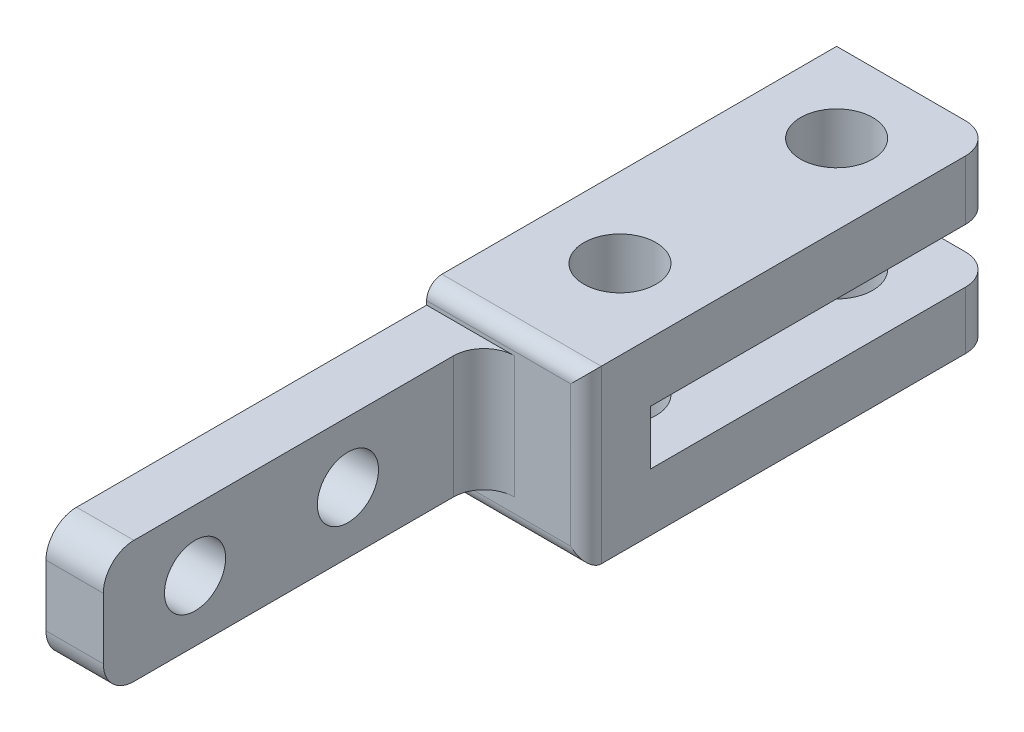
ISO-10303-21;
HEADER;
FILE_DESCRIPTION(('STEP AP214'),'2;1');
FILE_NAME('part.step','',(''),(''),'','','');
FILE_SCHEMA(('AUTOMOTIVE_DESIGN { 1 0 10303 214 1 1 1 1 }'));
ENDSEC;
DATA;
#1=APPLICATION_CONTEXT('core data for automotive mechanical design processes');
#2=APPLICATION_PROTOCOL_DEFINITION('international standard','automotive_design',2000,#1);
#3=PRODUCT_CONTEXT('',#1,'mechanical');
#4=PRODUCT('Part','Part','',(#3));
#5=PRODUCT_RELATED_PRODUCT_CATEGORY('part','',(#4));
#6=PRODUCT_DEFINITION_FORMATION('','',#4);
#7=PRODUCT_DEFINITION_CONTEXT('part definition',#1,'design');
#8=PRODUCT_DEFINITION('design','',#6,#7);
#9=PRODUCT_DEFINITION_SHAPE('','',#8);
#10=(LENGTH_UNIT() NAMED_UNIT(*) SI_UNIT(.MILLI.,.METRE.));
#11=(NAMED_UNIT(*) PLANE_ANGLE_UNIT() SI_UNIT($,.RADIAN.));
#12=(NAMED_UNIT(*) SI_UNIT($,.STERADIAN.) SOLID_ANGLE_UNIT());
#13=UNCERTAINTY_MEASURE_WITH_UNIT(LENGTH_MEASURE(1.E-05),#10,'distance_accuracy_value','');
#14=(GEOMETRIC_REPRESENTATION_CONTEXT(3) GLOBAL_UNCERTAINTY_ASSIGNED_CONTEXT((#13)) GLOBAL_UNIT_ASSIGNED_CONTEXT((#10,
#11,#12)) REPRESENTATION_CONTEXT('',''));
#15=CARTESIAN_POINT('',(0.,0.,0.));
#16=DIRECTION('',(0.,0.,1.));
#17=DIRECTION('',(1.,0.,0.));
#18=AXIS2_PLACEMENT_3D('',#15,#16,#17);
#19=CARTESIAN_POINT('',(0.,-2.4765,-30.8864));
#20=DIRECTION('',(0.,0.,-1.));
#21=DIRECTION('',(-1.,0.,0.));
#22=AXIS2_PLACEMENT_3D('',#19,#20,#21);
#23=PLANE('',#22);
#24=DIRECTION('',(-1.,0.,0.));
#25=VECTOR('',#24,1.);
#26=CARTESIAN_POINT('',(0.,2.30886,-30.8864));
#27=LINE('',#26,#25);
#28=CARTESIAN_POINT('',(10.69848,2.30886,-30.8864));
#29=VERTEX_POINT('',#28);
#30=CARTESIAN_POINT('',(0.,2.30886,-30.8864));
#31=VERTEX_POINT('',#30);
#32=EDGE_CURVE('E189',#29,#31,#27,.T.);
#33=ORIENTED_EDGE('',*,*,#32,.F.);
#34=DIRECTION('',(0.,1.,0.));
#35=VECTOR('',#34,1.);
#36=CARTESIAN_POINT('',(10.69848,-2.4765,-30.8864));
#37=LINE('',#36,#35);
#38=CARTESIAN_POINT('',(10.69848,-2.4765,-30.8864));
#39=VERTEX_POINT('',#38);
#40=EDGE_CURVE('E287',#29,#39,#37,.F.);
#41=ORIENTED_EDGE('',*,*,#40,.T.);
#42=DIRECTION('',(-1.,0.,0.));
#43=VECTOR('',#42,1.);
#44=CARTESIAN_POINT('',(0.,-2.4765,-30.8864));
#45=LINE('',#44,#43);
#46=CARTESIAN_POINT('',(0.,-2.4765,-30.8864));
#47=VERTEX_POINT('',#46);
#48=EDGE_CURVE('E232',#39,#47,#45,.T.);
#49=ORIENTED_EDGE('',*,*,#48,.T.);
#50=DIRECTION('',(0.,1.,0.));
#51=VECTOR('',#50,1.);
#52=CARTESIAN_POINT('',(0.,-2.4765,-30.8864));
#53=LINE('',#52,#51);
#54=EDGE_CURVE('E235',#47,#31,#53,.T.);
#55=ORIENTED_EDGE('',*,*,#54,.T.);
#56=EDGE_LOOP('',(#33,#41,#49,#55));
#57=FACE_BOUND('',#56,.T.);
#58=ADVANCED_FACE('F36',(#57),#23,.T.);
#59=CARTESIAN_POINT('',(6.61924,-2.4765,-6.26618));
#60=DIRECTION('',(0.,1.,0.));
#61=DIRECTION('',(0.,0.,1.));
#62=AXIS2_PLACEMENT_3D('',#59,#60,#61);
#63=CYLINDRICAL_SURFACE('',#62,2.99974);
#64=CARTESIAN_POINT('',(6.61924,2.30886,-6.26618));
#65=DIRECTION('',(0.,-1.,0.));
#66=DIRECTION('',(1.,0.,0.));
#67=AXIS2_PLACEMENT_3D('',#64,#65,#66);
#68=CIRCLE('',#67,2.99974);
#69=CARTESIAN_POINT('',(9.61898,2.30886,-6.26618));
#70=VERTEX_POINT('',#69);
#71=EDGE_CURVE('E207',#70,#70,#68,.F.);
#72=ORIENTED_EDGE('',*,*,#71,.T.);
#73=EDGE_LOOP('',(#72));
#74=FACE_BOUND('',#73,.T.);
#75=CARTESIAN_POINT('',(6.61924,-2.4765,-6.26618));
#76=DIRECTION('',(0.,1.,0.));
#77=DIRECTION('',(0.,0.,1.));
#78=AXIS2_PLACEMENT_3D('',#75,#76,#77);
#79=CIRCLE('',#78,2.99974);
#80=CARTESIAN_POINT('',(6.61924,-2.4765,-3.26644000000001));
#81=VERTEX_POINT('',#80);
#82=EDGE_CURVE('E225',#81,#81,#79,.T.);
#83=ORIENTED_EDGE('',*,*,#82,.F.);
#84=EDGE_LOOP('',(#83));
#85=FACE_BOUND('',#84,.T.);
#86=ADVANCED_FACE('F431',(#74,#85),#63,.F.);
#87=CARTESIAN_POINT('',(6.61924,-2.4765,-24.26716));
#88=DIRECTION('',(0.,1.,0.));
#89=DIRECTION('',(0.,0.,1.));
#90=AXIS2_PLACEMENT_3D('',#87,#88,#89);
#91=CYLINDRICAL_SURFACE('',#90,2.99974);
#92=CARTESIAN_POINT('',(6.61924,2.30886,-24.26716));
#93=DIRECTION('',(0.,-1.,0.));
#94=DIRECTION('',(1.,0.,0.));
#95=AXIS2_PLACEMENT_3D('',#92,#93,#94);
#96=CIRCLE('',#95,2.99974);
#97=CARTESIAN_POINT('',(9.61898,2.30886,-24.26716));
#98=VERTEX_POINT('',#97);
#99=EDGE_CURVE('E205',#98,#98,#96,.F.);
#100=ORIENTED_EDGE('',*,*,#99,.T.);
#101=EDGE_LOOP('',(#100));
#102=FACE_BOUND('',#101,.T.);
#103=CARTESIAN_POINT('',(6.61924,-2.4765,-24.26716));
#104=DIRECTION('',(0.,1.,0.));
#105=DIRECTION('',(0.,0.,1.));
#106=AXIS2_PLACEMENT_3D('',#103,#104,#105);
#107=CIRCLE('',#106,2.99974);
#108=CARTESIAN_POINT('',(6.61924,-2.4765,-21.26742));
#109=VERTEX_POINT('',#108);
#110=EDGE_CURVE('E222',#109,#109,#107,.T.);
#111=ORIENTED_EDGE('',*,*,#110,.F.);
#112=EDGE_LOOP('',(#111));
#113=FACE_BOUND('',#112,.T.);
#114=ADVANCED_FACE('F435',(#102,#113),#91,.F.);
#115=CARTESIAN_POINT('',(0.,10.16,0.));
#116=DIRECTION('',(1.,0.,0.));
#117=DIRECTION('',(0.,0.,-1.));
#118=AXIS2_PLACEMENT_3D('',#115,#116,#117);
#119=PLANE('',#118);
#120=CARTESIAN_POINT('',(0.,5.08,27.178));
#121=DIRECTION('',(1.,0.,0.));
#122=DIRECTION('',(0.,0.,-1.));
#123=AXIS2_PLACEMENT_3D('',#120,#121,#122);
#124=CIRCLE('',#123,2.54);
#125=CARTESIAN_POINT('',(0.,5.08,24.638));
#126=VERTEX_POINT('',#125);
#127=EDGE_CURVE('E243',#126,#126,#124,.T.);
#128=ORIENTED_EDGE('',*,*,#127,.T.);
#129=EDGE_LOOP('',(#128));
#130=FACE_BOUND('',#129,.T.);
#131=CARTESIAN_POINT('',(0.,5.08,14.478));
#132=DIRECTION('',(1.,0.,0.));
#133=DIRECTION('',(0.,0.,-1.));
#134=AXIS2_PLACEMENT_3D('',#131,#132,#133);
#135=CIRCLE('',#134,2.54);
#136=CARTESIAN_POINT('',(0.,5.08,11.938));
#137=VERTEX_POINT('',#136);
#138=EDGE_CURVE('E242',#137,#137,#135,.T.);
#139=ORIENTED_EDGE('',*,*,#138,.T.);
#140=EDGE_LOOP('',(#139));
#141=FACE_BOUND('',#140,.T.);
#142=DIRECTION('',(0.,0.,1.));
#143=VECTOR('',#142,1.);
#144=CARTESIAN_POINT('',(0.,-2.4765,-30.8864));
#145=LINE('',#144,#143);
#146=CARTESIAN_POINT('',(0.,-2.4765,1.905));
#147=VERTEX_POINT('',#146);
#148=EDGE_CURVE('E228',#47,#147,#145,.T.);
#149=ORIENTED_EDGE('',*,*,#148,.T.);
#150=CARTESIAN_POINT('',(0.,-1.2065,1.905));
#151=DIRECTION('',(1.,0.,0.));
#152=DIRECTION('',(0.,0.,-1.));
#153=AXIS2_PLACEMENT_3D('',#150,#151,#152);
#154=CIRCLE('',#153,1.27);
#155=CARTESIAN_POINT('',(0.,-1.2065,3.175));
#156=VERTEX_POINT('',#155);
#157=EDGE_CURVE('E337',#147,#156,#154,.F.);
#158=ORIENTED_EDGE('',*,*,#157,.T.);
#159=DIRECTION('',(0.,1.,0.));
#160=VECTOR('',#159,1.);
#161=CARTESIAN_POINT('',(0.,-2.4765,3.175));
#162=LINE('',#161,#160);
#163=CARTESIAN_POINT('',(0.,0.,3.175));
#164=VERTEX_POINT('',#163);
#165=EDGE_CURVE('E239',#156,#164,#162,.T.);
#166=ORIENTED_EDGE('',*,*,#165,.T.);
#167=DIRECTION('',(0.,0.,1.));
#168=VECTOR('',#167,1.);
#169=CARTESIAN_POINT('',(0.,0.,0.));
#170=LINE('',#169,#168);
#171=CARTESIAN_POINT('',(0.,0.,32.258));
#172=VERTEX_POINT('',#171);
#173=EDGE_CURVE('E246',#164,#172,#170,.T.);
#174=ORIENTED_EDGE('',*,*,#173,.T.);
#175=CARTESIAN_POINT('',(0.,2.54,32.258));
#176=DIRECTION('',(1.,0.,0.));
#177=DIRECTION('',(0.,0.,-1.));
#178=AXIS2_PLACEMENT_3D('',#175,#176,#177);
#179=CIRCLE('',#178,2.54);
#180=CARTESIAN_POINT('',(0.,2.54,34.798));
#181=VERTEX_POINT('',#180);
#182=EDGE_CURVE('E317',#172,#181,#179,.F.);
#183=ORIENTED_EDGE('',*,*,#182,.T.);
#184=DIRECTION('',(0.,-1.,0.));
#185=VECTOR('',#184,1.);
#186=CARTESIAN_POINT('',(0.,10.16,34.798));
#187=LINE('',#186,#185);
#188=CARTESIAN_POINT('',(0.,7.62,34.798));
#189=VERTEX_POINT('',#188);
#190=EDGE_CURVE('E269',#189,#181,#187,.T.);
#191=ORIENTED_EDGE('',*,*,#190,.F.);
#192=CARTESIAN_POINT('',(0.,7.62,32.258));
#193=DIRECTION('',(1.,0.,0.));
#194=DIRECTION('',(0.,0.,-1.));
#195=AXIS2_PLACEMENT_3D('',#192,#193,#194);
#196=CIRCLE('',#195,2.54);
#197=CARTESIAN_POINT('',(0.,10.16,32.258));
#198=VERTEX_POINT('',#197);
#199=EDGE_CURVE('E315',#189,#198,#196,.F.);
#200=ORIENTED_EDGE('',*,*,#199,.T.);
#201=DIRECTION('',(0.,0.,1.));
#202=VECTOR('',#201,1.);
#203=CARTESIAN_POINT('',(0.,10.16,0.));
#204=LINE('',#203,#202);
#205=CARTESIAN_POINT('',(0.,10.16,3.175));
#206=VERTEX_POINT('',#205);
#207=EDGE_CURVE('E255',#206,#198,#204,.T.);
#208=ORIENTED_EDGE('',*,*,#207,.F.);
#209=CARTESIAN_POINT('',(0.,10.4775,3.175));
#210=VERTEX_POINT('',#209);
#211=EDGE_CURVE('E234',#206,#210,#162,.T.);
#212=ORIENTED_EDGE('',*,*,#211,.T.);
#213=CARTESIAN_POINT('',(0.,10.4775,1.905));
#214=DIRECTION('',(1.,0.,0.));
#215=DIRECTION('',(0.,0.,-1.));
#216=AXIS2_PLACEMENT_3D('',#213,#214,#215);
#217=CIRCLE('',#216,1.27);
#218=CARTESIAN_POINT('',(0.,11.7475,1.905));
#219=VERTEX_POINT('',#218);
#220=EDGE_CURVE('E59',#210,#219,#217,.F.);
#221=ORIENTED_EDGE('',*,*,#220,.T.);
#222=DIRECTION('',(0.,0.,1.));
#223=VECTOR('',#222,1.);
#224=CARTESIAN_POINT('',(0.,11.7475,-30.8864));
#225=LINE('',#224,#223);
#226=CARTESIAN_POINT('',(0.,11.7475,-30.8864));
#227=VERTEX_POINT('',#226);
#228=EDGE_CURVE('E216',#227,#219,#225,.T.);
#229=ORIENTED_EDGE('',*,*,#228,.F.);
#230=CARTESIAN_POINT('',(0.,6.81736,-30.8864));
#231=VERTEX_POINT('',#230);
#232=EDGE_CURVE('E195',#231,#227,#53,.T.);
#233=ORIENTED_EDGE('',*,*,#232,.F.);
#234=DIRECTION('',(0.,0.,-1.));
#235=VECTOR('',#234,1.);
#236=CARTESIAN_POINT('',(0.,6.81736,-2.18440000000001));
#237=LINE('',#236,#235);
#238=CARTESIAN_POINT('',(0.,6.81736,-2.18440000000001));
#239=VERTEX_POINT('',#238);
#240=EDGE_CURVE('E174',#239,#231,#237,.T.);
#241=ORIENTED_EDGE('',*,*,#240,.F.);
#242=DIRECTION('',(0.,1.,0.));
#243=VECTOR('',#242,1.);
#244=CARTESIAN_POINT('',(0.,6.81736,-2.18440000000001));
#245=LINE('',#244,#243);
#246=CARTESIAN_POINT('',(0.,2.30886,-2.18440000000001));
#247=VERTEX_POINT('',#246);
#248=EDGE_CURVE('E181',#247,#239,#245,.T.);
#249=ORIENTED_EDGE('',*,*,#248,.F.);
#250=DIRECTION('',(0.,0.,-1.));
#251=VECTOR('',#250,1.);
#252=CARTESIAN_POINT('',(0.,2.30886,-2.18440000000001));
#253=LINE('',#252,#251);
#254=EDGE_CURVE('E277',#247,#31,#253,.T.);
#255=ORIENTED_EDGE('',*,*,#254,.T.);
#256=ORIENTED_EDGE('',*,*,#54,.F.);
#257=EDGE_LOOP('',(#149,#158,#166,#174,#183,#191,#200,#208,#212,#221,#229,#233,#241,#249,#255,#256));
#258=FACE_BOUND('',#257,.T.);
#259=ADVANCED_FACE('F193',(#130,#141,#258),#119,.F.);
#260=CARTESIAN_POINT('',(0.,10.16,34.798));
#261=DIRECTION('',(0.,0.,-1.));
#262=DIRECTION('',(-1.,0.,0.));
#263=AXIS2_PLACEMENT_3D('',#260,#261,#262);
#264=PLANE('',#263);
#265=ORIENTED_EDGE('',*,*,#190,.T.);
#266=DIRECTION('',(1.,0.,0.));
#267=VECTOR('',#266,1.);
#268=CARTESIAN_POINT('',(0.,2.54,34.798));
#269=LINE('',#268,#267);
#270=CARTESIAN_POINT('',(4.7625,2.54,34.798));
#271=VERTEX_POINT('',#270);
#272=EDGE_CURVE('E310',#181,#271,#269,.T.);
#273=ORIENTED_EDGE('',*,*,#272,.T.);
#274=DIRECTION('',(0.,-1.,0.));
#275=VECTOR('',#274,1.);
#276=CARTESIAN_POINT('',(4.7625,10.16,34.798));
#277=LINE('',#276,#275);
#278=CARTESIAN_POINT('',(4.7625,7.62,34.798));
#279=VERTEX_POINT('',#278);
#280=EDGE_CURVE('E262',#279,#271,#277,.T.);
#281=ORIENTED_EDGE('',*,*,#280,.F.);
#282=DIRECTION('',(1.,0.,0.));
#283=VECTOR('',#282,1.);
#284=CARTESIAN_POINT('',(0.,7.62,34.798));
#285=LINE('',#284,#283);
#286=EDGE_CURVE('E308',#279,#189,#285,.F.);
#287=ORIENTED_EDGE('',*,*,#286,.T.);
#288=EDGE_LOOP('',(#265,#273,#281,#287));
#289=FACE_BOUND('',#288,.T.);
#290=ADVANCED_FACE('F392',(#289),#264,.F.);
#291=CARTESIAN_POINT('',(4.7625,10.16,0.));
#292=DIRECTION('',(-1.,0.,0.));
#293=DIRECTION('',(0.,0.,1.));
#294=AXIS2_PLACEMENT_3D('',#291,#292,#293);
#295=PLANE('',#294);
#296=CARTESIAN_POINT('',(4.7625,5.08,27.178));
#297=DIRECTION('',(1.,0.,0.));
#298=DIRECTION('',(0.,0.,-1.));
#299=AXIS2_PLACEMENT_3D('',#296,#297,#298);
#300=CIRCLE('',#299,2.54);
#301=CARTESIAN_POINT('',(4.7625,5.08,24.638));
#302=VERTEX_POINT('',#301);
#303=EDGE_CURVE('E247',#302,#302,#300,.T.);
#304=ORIENTED_EDGE('',*,*,#303,.F.);
#305=EDGE_LOOP('',(#304));
#306=FACE_BOUND('',#305,.T.);
#307=CARTESIAN_POINT('',(4.7625,5.08,14.478));
#308=DIRECTION('',(1.,0.,0.));
#309=DIRECTION('',(0.,0.,-1.));
#310=AXIS2_PLACEMENT_3D('',#307,#308,#309);
#311=CIRCLE('',#310,2.54);
#312=CARTESIAN_POINT('',(4.7625,5.08,11.938));
#313=VERTEX_POINT('',#312);
#314=EDGE_CURVE('E250',#313,#313,#311,.T.);
#315=ORIENTED_EDGE('',*,*,#314,.F.);
#316=EDGE_LOOP('',(#315));
#317=FACE_BOUND('',#316,.T.);
#318=DIRECTION('',(0.,0.,-1.));
#319=VECTOR('',#318,1.);
#320=CARTESIAN_POINT('',(4.7625,0.,0.));
#321=LINE('',#320,#319);
#322=CARTESIAN_POINT('',(4.7625,0.,32.258));
#323=VERTEX_POINT('',#322);
#324=CARTESIAN_POINT('',(4.7625,0.,5.715));
#325=VERTEX_POINT('',#324);
#326=EDGE_CURVE('E259',#323,#325,#321,.T.);
#327=ORIENTED_EDGE('',*,*,#326,.T.);
#328=DIRECTION('',(0.,1.,0.));
#329=VECTOR('',#328,1.);
#330=CARTESIAN_POINT('',(4.7625,10.16,5.715));
#331=LINE('',#330,#329);
#332=CARTESIAN_POINT('',(4.7625,10.16,5.715));
#333=VERTEX_POINT('',#332);
#334=EDGE_CURVE('E302',#325,#333,#331,.T.);
#335=ORIENTED_EDGE('',*,*,#334,.T.);
#336=DIRECTION('',(0.,0.,-1.));
#337=VECTOR('',#336,1.);
#338=CARTESIAN_POINT('',(4.7625,10.16,0.));
#339=LINE('',#338,#337);
#340=CARTESIAN_POINT('',(4.7625,10.16,32.258));
#341=VERTEX_POINT('',#340);
#342=EDGE_CURVE('E258',#341,#333,#339,.T.);
#343=ORIENTED_EDGE('',*,*,#342,.F.);
#344=CARTESIAN_POINT('',(4.7625,7.62,32.258));
#345=DIRECTION('',(-1.,0.,0.));
#346=DIRECTION('',(0.,0.,1.));
#347=AXIS2_PLACEMENT_3D('',#344,#345,#346);
#348=CIRCLE('',#347,2.54);
#349=EDGE_CURVE('E298',#341,#279,#348,.F.);
#350=ORIENTED_EDGE('',*,*,#349,.T.);
#351=ORIENTED_EDGE('',*,*,#280,.T.);
#352=CARTESIAN_POINT('',(4.7625,2.54,32.258));
#353=DIRECTION('',(-1.,0.,0.));
#354=DIRECTION('',(0.,0.,1.));
#355=AXIS2_PLACEMENT_3D('',#352,#353,#354);
#356=CIRCLE('',#355,2.54);
#357=EDGE_CURVE('E300',#271,#323,#356,.F.);
#358=ORIENTED_EDGE('',*,*,#357,.T.);
#359=EDGE_LOOP('',(#327,#335,#343,#350,#351,#358));
#360=FACE_BOUND('',#359,.T.);
#361=ADVANCED_FACE('F395',(#306,#317,#360),#295,.F.);
#362=CARTESIAN_POINT('',(0.,10.16,0.));
#363=DIRECTION('',(0.,1.,0.));
#364=DIRECTION('',(0.,0.,1.));
#365=AXIS2_PLACEMENT_3D('',#362,#363,#364);
#366=PLANE('',#365);
#367=ORIENTED_EDGE('',*,*,#207,.T.);
#368=DIRECTION('',(1.,0.,0.));
#369=VECTOR('',#368,1.);
#370=CARTESIAN_POINT('',(4.7625,10.16,32.258));
#371=LINE('',#370,#369);
#372=EDGE_CURVE('E319',#198,#341,#371,.T.);
#373=ORIENTED_EDGE('',*,*,#372,.T.);
#374=ORIENTED_EDGE('',*,*,#342,.T.);
#375=CARTESIAN_POINT('',(7.3025,10.16,5.715));
#376=DIRECTION('',(0.,1.,0.));
#377=DIRECTION('',(0.,0.,1.));
#378=AXIS2_PLACEMENT_3D('',#375,#376,#377);
#379=CIRCLE('',#378,2.54);
#380=CARTESIAN_POINT('',(7.3025,10.16,3.175));
#381=VERTEX_POINT('',#380);
#382=EDGE_CURVE('E322',#333,#381,#379,.F.);
#383=ORIENTED_EDGE('',*,*,#382,.T.);
#384=DIRECTION('',(1.,0.,0.));
#385=VECTOR('',#384,1.);
#386=CARTESIAN_POINT('',(0.,10.16,3.175));
#387=LINE('',#386,#385);
#388=EDGE_CURVE('E238',#206,#381,#387,.T.);
#389=ORIENTED_EDGE('',*,*,#388,.F.);
#390=EDGE_LOOP('',(#367,#373,#374,#383,#389));
#391=FACE_BOUND('',#390,.T.);
#392=ADVANCED_FACE('F403',(#391),#366,.T.);
#393=CARTESIAN_POINT('',(0.,0.,0.));
#394=DIRECTION('',(0.,1.,0.));
#395=DIRECTION('',(0.,0.,1.));
#396=AXIS2_PLACEMENT_3D('',#393,#394,#395);
#397=PLANE('',#396);
#398=ORIENTED_EDGE('',*,*,#326,.F.);
#399=DIRECTION('',(1.,0.,0.));
#400=VECTOR('',#399,1.);
#401=CARTESIAN_POINT('',(0.,0.,32.258));
#402=LINE('',#401,#400);
#403=EDGE_CURVE('E313',#323,#172,#402,.F.);
#404=ORIENTED_EDGE('',*,*,#403,.T.);
#405=ORIENTED_EDGE('',*,*,#173,.F.);
#406=DIRECTION('',(1.,0.,0.));
#407=VECTOR('',#406,1.);
#408=CARTESIAN_POINT('',(0.,0.,3.175));
#409=LINE('',#408,#407);
#410=CARTESIAN_POINT('',(7.3025,0.,3.175));
#411=VERTEX_POINT('',#410);
#412=EDGE_CURVE('E272',#164,#411,#409,.T.);
#413=ORIENTED_EDGE('',*,*,#412,.T.);
#414=CARTESIAN_POINT('',(7.3025,0.,5.715));
#415=DIRECTION('',(0.,1.,0.));
#416=DIRECTION('',(0.,0.,1.));
#417=AXIS2_PLACEMENT_3D('',#414,#415,#416);
#418=CIRCLE('',#417,2.54);
#419=EDGE_CURVE('E325',#411,#325,#418,.T.);
#420=ORIENTED_EDGE('',*,*,#419,.T.);
#421=EDGE_LOOP('',(#398,#404,#405,#413,#420));
#422=FACE_BOUND('',#421,.T.);
#423=ADVANCED_FACE('F547',(#422),#397,.F.);
#424=CARTESIAN_POINT('',(0.,5.08,14.478));
#425=DIRECTION('',(1.,0.,0.));
#426=DIRECTION('',(0.,0.,-1.));
#427=AXIS2_PLACEMENT_3D('',#424,#425,#426);
#428=CYLINDRICAL_SURFACE('',#427,2.54);
#429=ORIENTED_EDGE('',*,*,#138,.F.);
#430=EDGE_LOOP('',(#429));
#431=FACE_BOUND('',#430,.T.);
#432=ORIENTED_EDGE('',*,*,#314,.T.);
#433=EDGE_LOOP('',(#432));
#434=FACE_BOUND('',#433,.T.);
#435=ADVANCED_FACE('F426',(#431,#434),#428,.F.);
#436=CARTESIAN_POINT('',(0.,5.08,27.178));
#437=DIRECTION('',(1.,0.,0.));
#438=DIRECTION('',(0.,0.,-1.));
#439=AXIS2_PLACEMENT_3D('',#436,#437,#438);
#440=CYLINDRICAL_SURFACE('',#439,2.54);
#441=ORIENTED_EDGE('',*,*,#127,.F.);
#442=EDGE_LOOP('',(#441));
#443=FACE_BOUND('',#442,.T.);
#444=ORIENTED_EDGE('',*,*,#303,.T.);
#445=EDGE_LOOP('',(#444));
#446=FACE_BOUND('',#445,.T.);
#447=ADVANCED_FACE('F419',(#443,#446),#440,.F.);
#448=DIRECTION('',(-1.,0.,0.));
#449=VECTOR('',#448,1.);
#450=CARTESIAN_POINT('',(0.,11.7475,-30.8864));
#451=LINE('',#450,#449);
#452=CARTESIAN_POINT('',(10.69848,11.7475,-30.8864));
#453=VERTEX_POINT('',#452);
#454=EDGE_CURVE('E220',#453,#227,#451,.T.);
#455=ORIENTED_EDGE('',*,*,#454,.F.);
#456=DIRECTION('',(0.,1.,0.));
#457=VECTOR('',#456,1.);
#458=CARTESIAN_POINT('',(10.69848,-2.4765,-30.8864));
#459=LINE('',#458,#457);
#460=CARTESIAN_POINT('',(10.69848,6.81736,-30.8864));
#461=VERTEX_POINT('',#460);
#462=EDGE_CURVE('E294',#453,#461,#459,.F.);
#463=ORIENTED_EDGE('',*,*,#462,.T.);
#464=DIRECTION('',(1.,0.,0.));
#465=VECTOR('',#464,1.);
#466=CARTESIAN_POINT('',(0.,6.81736,-30.8864));
#467=LINE('',#466,#465);
#468=EDGE_CURVE('E346',#231,#461,#467,.T.);
#469=ORIENTED_EDGE('',*,*,#468,.F.);
#470=ORIENTED_EDGE('',*,*,#232,.T.);
#471=EDGE_LOOP('',(#455,#463,#469,#470));
#472=FACE_BOUND('',#471,.T.);
#473=ADVANCED_FACE('F417',(#472),#23,.T.);
#474=CARTESIAN_POINT('',(13.23848,-2.4765,3.175));
#475=DIRECTION('',(1.,0.,0.));
#476=DIRECTION('',(0.,0.,-1.));
#477=AXIS2_PLACEMENT_3D('',#474,#475,#476);
#478=PLANE('',#477);
#479=DIRECTION('',(0.,0.,-1.));
#480=VECTOR('',#479,1.);
#481=CARTESIAN_POINT('',(13.23848,11.7475,3.175));
#482=LINE('',#481,#480);
#483=CARTESIAN_POINT('',(13.23848,11.7475,1.905));
#484=VERTEX_POINT('',#483);
#485=CARTESIAN_POINT('',(13.23848,11.7475,-28.3464));
#486=VERTEX_POINT('',#485);
#487=EDGE_CURVE('E218',#484,#486,#482,.T.);
#488=ORIENTED_EDGE('',*,*,#487,.F.);
#489=DIRECTION('',(0.,1.,0.));
#490=VECTOR('',#489,1.);
#491=CARTESIAN_POINT('',(13.23848,-2.4765,1.905));
#492=LINE('',#491,#490);
#493=CARTESIAN_POINT('',(13.23848,-2.4765,1.905));
#494=VERTEX_POINT('',#493);
#495=EDGE_CURVE('E45',#484,#494,#492,.F.);
#496=ORIENTED_EDGE('',*,*,#495,.T.);
#497=DIRECTION('',(0.,0.,-1.));
#498=VECTOR('',#497,1.);
#499=CARTESIAN_POINT('',(13.23848,-2.4765,3.175));
#500=LINE('',#499,#498);
#501=CARTESIAN_POINT('',(13.23848,-2.4765,-28.3464));
#502=VERTEX_POINT('',#501);
#503=EDGE_CURVE('E230',#494,#502,#500,.T.);
#504=ORIENTED_EDGE('',*,*,#503,.T.);
#505=DIRECTION('',(0.,1.,0.));
#506=VECTOR('',#505,1.);
#507=CARTESIAN_POINT('',(13.23848,-2.4765,-28.3464));
#508=LINE('',#507,#506);
#509=CARTESIAN_POINT('',(13.23848,2.30886,-28.3464));
#510=VERTEX_POINT('',#509);
#511=EDGE_CURVE('E282',#502,#510,#508,.T.);
#512=ORIENTED_EDGE('',*,*,#511,.T.);
#513=DIRECTION('',(0.,0.,-1.));
#514=VECTOR('',#513,1.);
#515=CARTESIAN_POINT('',(13.23848,2.30886,-2.18440000000001));
#516=LINE('',#515,#514);
#517=CARTESIAN_POINT('',(13.23848,2.30886,-2.18440000000001));
#518=VERTEX_POINT('',#517);
#519=EDGE_CURVE('E197',#518,#510,#516,.T.);
#520=ORIENTED_EDGE('',*,*,#519,.F.);
#521=DIRECTION('',(0.,-1.,0.));
#522=VECTOR('',#521,1.);
#523=CARTESIAN_POINT('',(13.23848,6.81736,-2.18440000000001));
#524=LINE('',#523,#522);
#525=CARTESIAN_POINT('',(13.23848,6.81736,-2.18440000000001));
#526=VERTEX_POINT('',#525);
#527=EDGE_CURVE('E180',#526,#518,#524,.T.);
#528=ORIENTED_EDGE('',*,*,#527,.F.);
#529=DIRECTION('',(0.,0.,-1.));
#530=VECTOR('',#529,1.);
#531=CARTESIAN_POINT('',(13.23848,6.81736,-2.18440000000001));
#532=LINE('',#531,#530);
#533=CARTESIAN_POINT('',(13.23848,6.81736,-28.3464));
#534=VERTEX_POINT('',#533);
#535=EDGE_CURVE('E177',#526,#534,#532,.T.);
#536=ORIENTED_EDGE('',*,*,#535,.T.);
#537=DIRECTION('',(0.,1.,0.));
#538=VECTOR('',#537,1.);
#539=CARTESIAN_POINT('',(13.23848,-2.4765,-28.3464));
#540=LINE('',#539,#538);
#541=EDGE_CURVE('E274',#534,#486,#540,.T.);
#542=ORIENTED_EDGE('',*,*,#541,.T.);
#543=EDGE_LOOP('',(#488,#496,#504,#512,#520,#528,#536,#542));
#544=FACE_BOUND('',#543,.T.);
#545=ADVANCED_FACE('F362',(#544),#478,.T.);
#546=CARTESIAN_POINT('',(0.,-2.4765,3.175));
#547=DIRECTION('',(0.,0.,1.));
#548=DIRECTION('',(1.,0.,0.));
#549=AXIS2_PLACEMENT_3D('',#546,#547,#548);
#550=PLANE('',#549);
#551=ORIENTED_EDGE('',*,*,#165,.F.);
#552=DIRECTION('',(1.,0.,0.));
#553=VECTOR('',#552,1.);
#554=CARTESIAN_POINT('',(13.23848,-1.2065,3.175));
#555=LINE('',#554,#553);
#556=CARTESIAN_POINT('',(11.96848,-1.2065,3.175));
#557=VERTEX_POINT('',#556);
#558=EDGE_CURVE('E331',#156,#557,#555,.T.);
#559=ORIENTED_EDGE('',*,*,#558,.T.);
#560=DIRECTION('',(0.,1.,0.));
#561=VECTOR('',#560,1.);
#562=CARTESIAN_POINT('',(11.96848,-2.4765,3.175));
#563=LINE('',#562,#561);
#564=CARTESIAN_POINT('',(11.96848,10.4775,3.175));
#565=VERTEX_POINT('',#564);
#566=EDGE_CURVE('E329',#557,#565,#563,.T.);
#567=ORIENTED_EDGE('',*,*,#566,.T.);
#568=DIRECTION('',(1.,0.,0.));
#569=VECTOR('',#568,1.);
#570=CARTESIAN_POINT('',(0.,10.4775,3.175));
#571=LINE('',#570,#569);
#572=EDGE_CURVE('E327',#565,#210,#571,.F.);
#573=ORIENTED_EDGE('',*,*,#572,.T.);
#574=ORIENTED_EDGE('',*,*,#211,.F.);
#575=ORIENTED_EDGE('',*,*,#388,.T.);
#576=DIRECTION('',(0.,1.,0.));
#577=VECTOR('',#576,1.);
#578=CARTESIAN_POINT('',(7.3025,-2.4765,3.175));
#579=LINE('',#578,#577);
#580=EDGE_CURVE('E305',#381,#411,#579,.F.);
#581=ORIENTED_EDGE('',*,*,#580,.T.);
#582=ORIENTED_EDGE('',*,*,#412,.F.);
#583=EDGE_LOOP('',(#551,#559,#567,#573,#574,#575,#581,#582));
#584=FACE_BOUND('',#583,.T.);
#585=ADVANCED_FACE('F379',(#584),#550,.T.);
#586=CARTESIAN_POINT('',(0.,-2.4765,0.));
#587=DIRECTION('',(0.,1.,0.));
#588=DIRECTION('',(0.,0.,1.));
#589=AXIS2_PLACEMENT_3D('',#586,#587,#588);
#590=PLANE('',#589);
#591=ORIENTED_EDGE('',*,*,#110,.T.);
#592=EDGE_LOOP('',(#591));
#593=FACE_BOUND('',#592,.T.);
#594=ORIENTED_EDGE('',*,*,#82,.T.);
#595=EDGE_LOOP('',(#594));
#596=FACE_BOUND('',#595,.T.);
#597=ORIENTED_EDGE('',*,*,#503,.F.);
#598=DIRECTION('',(1.,0.,0.));
#599=VECTOR('',#598,1.);
#600=CARTESIAN_POINT('',(0.,-2.4765,1.905));
#601=LINE('',#600,#599);
#602=EDGE_CURVE('E334',#494,#147,#601,.F.);
#603=ORIENTED_EDGE('',*,*,#602,.T.);
#604=ORIENTED_EDGE('',*,*,#148,.F.);
#605=ORIENTED_EDGE('',*,*,#48,.F.);
#606=CARTESIAN_POINT('',(10.69848,-2.4765,-28.3464));
#607=DIRECTION('',(0.,1.,0.));
#608=DIRECTION('',(0.,0.,1.));
#609=AXIS2_PLACEMENT_3D('',#606,#607,#608);
#610=CIRCLE('',#609,2.54);
#611=EDGE_CURVE('E289',#39,#502,#610,.F.);
#612=ORIENTED_EDGE('',*,*,#611,.T.);
#613=EDGE_LOOP('',(#597,#603,#604,#605,#612));
#614=FACE_BOUND('',#613,.T.);
#615=ADVANCED_FACE('F374',(#593,#596,#614),#590,.F.);
#616=CARTESIAN_POINT('',(6.61924,6.81736,-6.26618));
#617=DIRECTION('',(0.,1.,0.));
#618=DIRECTION('',(-1.,0.,0.));
#619=AXIS2_PLACEMENT_3D('',#616,#617,#618);
#620=CIRCLE('',#619,2.99974);
#621=CARTESIAN_POINT('',(3.61950000000001,6.81736,-6.26618));
#622=VERTEX_POINT('',#621);
#623=EDGE_CURVE('E202',#622,#622,#620,.F.);
#624=ORIENTED_EDGE('',*,*,#623,.T.);
#625=EDGE_LOOP('',(#624));
#626=FACE_BOUND('',#625,.T.);
#627=CARTESIAN_POINT('',(6.61924,11.7475,-6.26618));
#628=DIRECTION('',(0.,1.,0.));
#629=DIRECTION('',(0.,0.,1.));
#630=AXIS2_PLACEMENT_3D('',#627,#628,#629);
#631=CIRCLE('',#630,2.99974);
#632=CARTESIAN_POINT('',(6.61924,11.7475,-3.26644000000001));
#633=VERTEX_POINT('',#632);
#634=EDGE_CURVE('E213',#633,#633,#631,.T.);
#635=ORIENTED_EDGE('',*,*,#634,.T.);
#636=EDGE_LOOP('',(#635));
#637=FACE_BOUND('',#636,.T.);
#638=ADVANCED_FACE('F438',(#626,#637),#63,.F.);
#639=CARTESIAN_POINT('',(6.61924,6.81736,-24.26716));
#640=DIRECTION('',(0.,1.,0.));
#641=DIRECTION('',(-1.,0.,0.));
#642=AXIS2_PLACEMENT_3D('',#639,#640,#641);
#643=CIRCLE('',#642,2.99974);
#644=CARTESIAN_POINT('',(3.6195,6.81736,-24.26716));
#645=VERTEX_POINT('',#644);
#646=EDGE_CURVE('E206',#645,#645,#643,.F.);
#647=ORIENTED_EDGE('',*,*,#646,.T.);
#648=EDGE_LOOP('',(#647));
#649=FACE_BOUND('',#648,.T.);
#650=CARTESIAN_POINT('',(6.61924,11.7475,-24.26716));
#651=DIRECTION('',(0.,1.,0.));
#652=DIRECTION('',(0.,0.,1.));
#653=AXIS2_PLACEMENT_3D('',#650,#651,#652);
#654=CIRCLE('',#653,2.99974);
#655=CARTESIAN_POINT('',(6.61924,11.7475,-21.26742));
#656=VERTEX_POINT('',#655);
#657=EDGE_CURVE('E210',#656,#656,#654,.T.);
#658=ORIENTED_EDGE('',*,*,#657,.T.);
#659=EDGE_LOOP('',(#658));
#660=FACE_BOUND('',#659,.T.);
#661=ADVANCED_FACE('F444',(#649,#660),#91,.F.);
#662=CARTESIAN_POINT('',(0.,11.7475,0.));
#663=DIRECTION('',(0.,1.,0.));
#664=DIRECTION('',(0.,0.,1.));
#665=AXIS2_PLACEMENT_3D('',#662,#663,#664);
#666=PLANE('',#665);
#667=ORIENTED_EDGE('',*,*,#634,.F.);
#668=EDGE_LOOP('',(#667));
#669=FACE_BOUND('',#668,.T.);
#670=ORIENTED_EDGE('',*,*,#228,.T.);
#671=DIRECTION('',(1.,0.,0.));
#672=VECTOR('',#671,1.);
#673=CARTESIAN_POINT('',(0.,11.7475,1.905));
#674=LINE('',#673,#672);
#675=EDGE_CURVE('E11',#219,#484,#674,.T.);
#676=ORIENTED_EDGE('',*,*,#675,.T.);
#677=ORIENTED_EDGE('',*,*,#487,.T.);
#678=CARTESIAN_POINT('',(10.69848,11.7475,-28.3464));
#679=DIRECTION('',(0.,1.,0.));
#680=DIRECTION('',(0.,0.,1.));
#681=AXIS2_PLACEMENT_3D('',#678,#679,#680);
#682=CIRCLE('',#681,2.54);
#683=EDGE_CURVE('E292',#486,#453,#682,.T.);
#684=ORIENTED_EDGE('',*,*,#683,.T.);
#685=ORIENTED_EDGE('',*,*,#454,.T.);
#686=EDGE_LOOP('',(#670,#676,#677,#684,#685));
#687=FACE_BOUND('',#686,.T.);
#688=ORIENTED_EDGE('',*,*,#657,.F.);
#689=EDGE_LOOP('',(#688));
#690=FACE_BOUND('',#689,.T.);
#691=ADVANCED_FACE('F410',(#669,#687,#690),#666,.T.);
#692=CARTESIAN_POINT('',(0.,2.30886,-2.18440000000001));
#693=DIRECTION('',(0.,-1.,0.));
#694=DIRECTION('',(1.,0.,0.));
#695=AXIS2_PLACEMENT_3D('',#692,#693,#694);
#696=PLANE('',#695);
#697=ORIENTED_EDGE('',*,*,#99,.F.);
#698=EDGE_LOOP('',(#697));
#699=FACE_BOUND('',#698,.T.);
#700=ORIENTED_EDGE('',*,*,#519,.T.);
#701=CARTESIAN_POINT('',(10.69848,2.30886,-28.3464));
#702=DIRECTION('',(0.,-1.,0.));
#703=DIRECTION('',(1.,0.,0.));
#704=AXIS2_PLACEMENT_3D('',#701,#702,#703);
#705=CIRCLE('',#704,2.54);
#706=EDGE_CURVE('E285',#510,#29,#705,.F.);
#707=ORIENTED_EDGE('',*,*,#706,.T.);
#708=ORIENTED_EDGE('',*,*,#32,.T.);
#709=ORIENTED_EDGE('',*,*,#254,.F.);
#710=DIRECTION('',(-1.,0.,0.));
#711=VECTOR('',#710,1.);
#712=CARTESIAN_POINT('',(0.,2.30886,-2.18440000000001));
#713=LINE('',#712,#711);
#714=EDGE_CURVE('E187',#518,#247,#713,.T.);
#715=ORIENTED_EDGE('',*,*,#714,.F.);
#716=EDGE_LOOP('',(#700,#707,#708,#709,#715));
#717=FACE_BOUND('',#716,.T.);
#718=ORIENTED_EDGE('',*,*,#71,.F.);
#719=EDGE_LOOP('',(#718));
#720=FACE_BOUND('',#719,.T.);
#721=ADVANCED_FACE('F358',(#699,#717,#720),#696,.F.);
#722=CARTESIAN_POINT('',(0.,6.81736,-2.18440000000001));
#723=DIRECTION('',(0.,1.,0.));
#724=DIRECTION('',(-1.,0.,0.));
#725=AXIS2_PLACEMENT_3D('',#722,#723,#724);
#726=PLANE('',#725);
#727=ORIENTED_EDGE('',*,*,#646,.F.);
#728=EDGE_LOOP('',(#727));
#729=FACE_BOUND('',#728,.T.);
#730=ORIENTED_EDGE('',*,*,#468,.T.);
#731=CARTESIAN_POINT('',(10.69848,6.81736,-28.3464));
#732=DIRECTION('',(0.,1.,0.));
#733=DIRECTION('',(-1.,0.,0.));
#734=AXIS2_PLACEMENT_3D('',#731,#732,#733);
#735=CIRCLE('',#734,2.54);
#736=EDGE_CURVE('E296',#461,#534,#735,.F.);
#737=ORIENTED_EDGE('',*,*,#736,.T.);
#738=ORIENTED_EDGE('',*,*,#535,.F.);
#739=DIRECTION('',(1.,0.,0.));
#740=VECTOR('',#739,1.);
#741=CARTESIAN_POINT('',(0.,6.81736,-2.18440000000001));
#742=LINE('',#741,#740);
#743=EDGE_CURVE('E168',#239,#526,#742,.T.);
#744=ORIENTED_EDGE('',*,*,#743,.F.);
#745=ORIENTED_EDGE('',*,*,#240,.T.);
#746=EDGE_LOOP('',(#730,#737,#738,#744,#745));
#747=FACE_BOUND('',#746,.T.);
#748=ORIENTED_EDGE('',*,*,#623,.F.);
#749=EDGE_LOOP('',(#748));
#750=FACE_BOUND('',#749,.T.);
#751=ADVANCED_FACE('F171',(#729,#747,#750),#726,.F.);
#752=CARTESIAN_POINT('',(0.,0.,-2.18440000000001));
#753=DIRECTION('',(0.,0.,1.));
#754=DIRECTION('',(1.,0.,0.));
#755=AXIS2_PLACEMENT_3D('',#752,#753,#754);
#756=PLANE('',#755);
#757=ORIENTED_EDGE('',*,*,#248,.T.);
#758=ORIENTED_EDGE('',*,*,#743,.T.);
#759=ORIENTED_EDGE('',*,*,#527,.T.);
#760=ORIENTED_EDGE('',*,*,#714,.T.);
#761=EDGE_LOOP('',(#757,#758,#759,#760));
#762=FACE_BOUND('',#761,.T.);
#763=ADVANCED_FACE('F185',(#762),#756,.F.);
#764=CARTESIAN_POINT('',(10.69848,-2.4765,-28.3464));
#765=DIRECTION('',(0.,1.,0.));
#766=DIRECTION('',(0.,0.,1.));
#767=AXIS2_PLACEMENT_3D('',#764,#765,#766);
#768=CYLINDRICAL_SURFACE('',#767,2.54);
#769=ORIENTED_EDGE('',*,*,#611,.F.);
#770=ORIENTED_EDGE('',*,*,#40,.F.);
#771=ORIENTED_EDGE('',*,*,#706,.F.);
#772=ORIENTED_EDGE('',*,*,#511,.F.);
#773=EDGE_LOOP('',(#769,#770,#771,#772));
#774=FACE_BOUND('',#773,.T.);
#775=ADVANCED_FACE('F367',(#774),#768,.T.);
#776=CARTESIAN_POINT('',(10.69848,-2.4765,-28.3464));
#777=DIRECTION('',(0.,1.,0.));
#778=DIRECTION('',(0.,0.,1.));
#779=AXIS2_PLACEMENT_3D('',#776,#777,#778);
#780=CYLINDRICAL_SURFACE('',#779,2.54);
#781=ORIENTED_EDGE('',*,*,#736,.F.);
#782=ORIENTED_EDGE('',*,*,#462,.F.);
#783=ORIENTED_EDGE('',*,*,#683,.F.);
#784=ORIENTED_EDGE('',*,*,#541,.F.);
#785=EDGE_LOOP('',(#781,#782,#783,#784));
#786=FACE_BOUND('',#785,.T.);
#787=ADVANCED_FACE('F415',(#786),#780,.T.);
#788=CARTESIAN_POINT('',(7.3025,10.16,5.715));
#789=DIRECTION('',(0.,1.,0.));
#790=DIRECTION('',(0.,0.,1.));
#791=AXIS2_PLACEMENT_3D('',#788,#789,#790);
#792=CYLINDRICAL_SURFACE('',#791,2.54);
#793=ORIENTED_EDGE('',*,*,#419,.F.);
#794=ORIENTED_EDGE('',*,*,#580,.F.);
#795=ORIENTED_EDGE('',*,*,#382,.F.);
#796=ORIENTED_EDGE('',*,*,#334,.F.);
#797=EDGE_LOOP('',(#793,#794,#795,#796));
#798=FACE_BOUND('',#797,.T.);
#799=ADVANCED_FACE('F477',(#798),#792,.F.);
#800=CARTESIAN_POINT('',(0.,2.54,32.258));
#801=DIRECTION('',(1.,0.,0.));
#802=DIRECTION('',(0.,0.,-1.));
#803=AXIS2_PLACEMENT_3D('',#800,#801,#802);
#804=CYLINDRICAL_SURFACE('',#803,2.54);
#805=ORIENTED_EDGE('',*,*,#182,.F.);
#806=ORIENTED_EDGE('',*,*,#403,.F.);
#807=ORIENTED_EDGE('',*,*,#357,.F.);
#808=ORIENTED_EDGE('',*,*,#272,.F.);
#809=EDGE_LOOP('',(#805,#806,#807,#808));
#810=FACE_BOUND('',#809,.T.);
#811=ADVANCED_FACE('F389',(#810),#804,.T.);
#812=CARTESIAN_POINT('',(0.,7.62,32.258));
#813=DIRECTION('',(-1.,0.,0.));
#814=DIRECTION('',(0.,0.,1.));
#815=AXIS2_PLACEMENT_3D('',#812,#813,#814);
#816=CYLINDRICAL_SURFACE('',#815,2.54);
#817=ORIENTED_EDGE('',*,*,#199,.F.);
#818=ORIENTED_EDGE('',*,*,#286,.F.);
#819=ORIENTED_EDGE('',*,*,#349,.F.);
#820=ORIENTED_EDGE('',*,*,#372,.F.);
#821=EDGE_LOOP('',(#817,#818,#819,#820));
#822=FACE_BOUND('',#821,.T.);
#823=ADVANCED_FACE('F401',(#822),#816,.T.);
#824=CARTESIAN_POINT('',(0.,10.4775,1.905));
#825=DIRECTION('',(1.,0.,0.));
#826=DIRECTION('',(0.,0.,-1.));
#827=AXIS2_PLACEMENT_3D('',#824,#825,#826);
#828=CYLINDRICAL_SURFACE('',#827,1.27);
#829=ORIENTED_EDGE('',*,*,#220,.F.);
#830=ORIENTED_EDGE('',*,*,#572,.F.);
#831=CARTESIAN_POINT('',(11.96848,10.4775,1.905));
#832=DIRECTION('',(0.707106781186547,-0.707106781186547,0.));
#833=DIRECTION('',(0.707106781186547,0.707106781186547,0.));
#834=AXIS2_PLACEMENT_3D('',#831,#832,#833);
#835=ELLIPSE('',#834,1.79605122421383,1.27);
#836=EDGE_CURVE('E40',#484,#565,#835,.T.);
#837=ORIENTED_EDGE('',*,*,#836,.F.);
#838=ORIENTED_EDGE('',*,*,#675,.F.);
#839=EDGE_LOOP('',(#829,#830,#837,#838));
#840=FACE_BOUND('',#839,.T.);
#841=ADVANCED_FACE('F38',(#840),#828,.T.);
#842=CARTESIAN_POINT('',(11.96848,-2.4765,1.905));
#843=DIRECTION('',(0.,1.,0.));
#844=DIRECTION('',(0.,0.,1.));
#845=AXIS2_PLACEMENT_3D('',#842,#843,#844);
#846=CYLINDRICAL_SURFACE('',#845,1.27);
#847=ORIENTED_EDGE('',*,*,#836,.T.);
#848=ORIENTED_EDGE('',*,*,#566,.F.);
#849=CARTESIAN_POINT('',(11.96848,-1.2065,1.905));
#850=DIRECTION('',(0.707106781186547,0.707106781186547,0.));
#851=DIRECTION('',(-0.707106781186547,0.707106781186547,0.));
#852=AXIS2_PLACEMENT_3D('',#849,#850,#851);
#853=ELLIPSE('',#852,1.79605122421383,1.27);
#854=EDGE_CURVE('E339',#494,#557,#853,.F.);
#855=ORIENTED_EDGE('',*,*,#854,.F.);
#856=ORIENTED_EDGE('',*,*,#495,.F.);
#857=EDGE_LOOP('',(#847,#848,#855,#856));
#858=FACE_BOUND('',#857,.T.);
#859=ADVANCED_FACE('F407',(#858),#846,.T.);
#860=CARTESIAN_POINT('',(0.,-1.2065,1.905));
#861=DIRECTION('',(-1.,0.,0.));
#862=DIRECTION('',(0.,0.,1.));
#863=AXIS2_PLACEMENT_3D('',#860,#861,#862);
#864=CYLINDRICAL_SURFACE('',#863,1.27);
#865=ORIENTED_EDGE('',*,*,#157,.F.);
#866=ORIENTED_EDGE('',*,*,#602,.F.);
#867=ORIENTED_EDGE('',*,*,#854,.T.);
#868=ORIENTED_EDGE('',*,*,#558,.F.);
#869=EDGE_LOOP('',(#865,#866,#867,#868));
#870=FACE_BOUND('',#869,.T.);
#871=ADVANCED_FACE('F377',(#870),#864,.T.);
#872=CLOSED_SHELL('',(#58,#86,#114,#259,#290,#361,#392,#423,#435,#447,#473,#545,#585,#615,#638,
#661,#691,#721,#751,#763,#775,#787,#799,#811,#823,#841,#859,#871));
#873=MANIFOLD_SOLID_BREP('B2',#872);
#874=ADVANCED_BREP_SHAPE_REPRESENTATION('',(#18,#873),#14);
#875=SHAPE_DEFINITION_REPRESENTATION(#9,#874);
ENDSEC;
END-ISO-10303-21;
